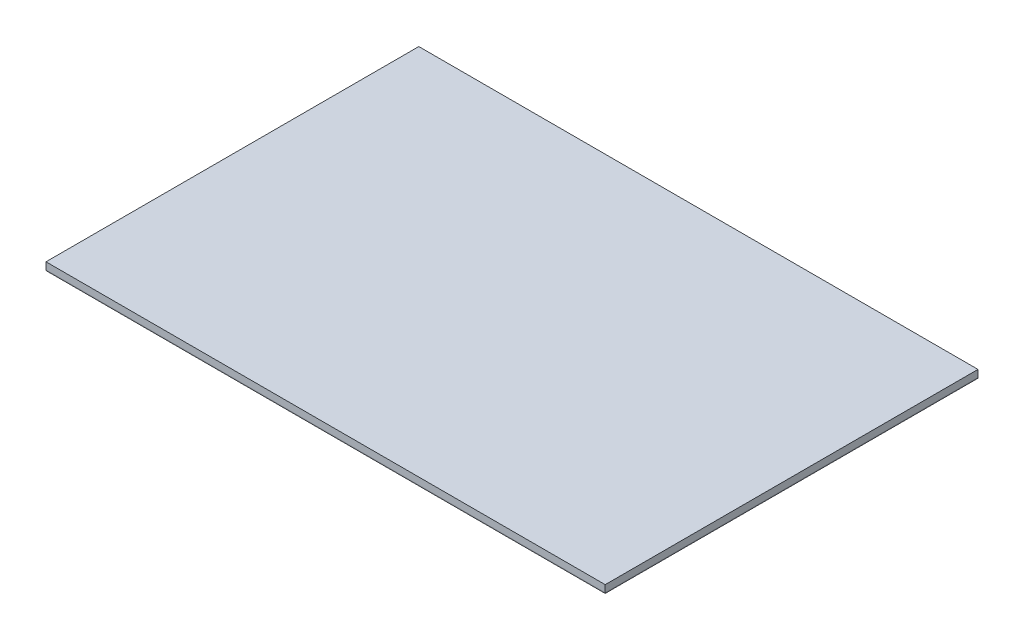
ISO-10303-21;
HEADER;
FILE_DESCRIPTION(('STEP AP214'),'2;1');
FILE_NAME('part.step','',(''),(''),'','','');
FILE_SCHEMA(('AUTOMOTIVE_DESIGN { 1 0 10303 214 1 1 1 1 }'));
ENDSEC;
DATA;
#1=APPLICATION_CONTEXT('core data for automotive mechanical design processes');
#2=APPLICATION_PROTOCOL_DEFINITION('international standard','automotive_design',2000,#1);
#3=PRODUCT_CONTEXT('',#1,'mechanical');
#4=PRODUCT('Part','Part','',(#3));
#5=PRODUCT_RELATED_PRODUCT_CATEGORY('part','',(#4));
#6=PRODUCT_DEFINITION_FORMATION('','',#4);
#7=PRODUCT_DEFINITION_CONTEXT('part definition',#1,'design');
#8=PRODUCT_DEFINITION('design','',#6,#7);
#9=PRODUCT_DEFINITION_SHAPE('','',#8);
#10=(LENGTH_UNIT() NAMED_UNIT(*) SI_UNIT(.MILLI.,.METRE.));
#11=(NAMED_UNIT(*) PLANE_ANGLE_UNIT() SI_UNIT($,.RADIAN.));
#12=(NAMED_UNIT(*) SI_UNIT($,.STERADIAN.) SOLID_ANGLE_UNIT());
#13=UNCERTAINTY_MEASURE_WITH_UNIT(LENGTH_MEASURE(1.E-05),#10,'distance_accuracy_value','');
#14=(GEOMETRIC_REPRESENTATION_CONTEXT(3) GLOBAL_UNCERTAINTY_ASSIGNED_CONTEXT((#13)) GLOBAL_UNIT_ASSIGNED_CONTEXT((#10,
#11,#12)) REPRESENTATION_CONTEXT('',''));
#15=CARTESIAN_POINT('',(0.,0.,0.));
#16=DIRECTION('',(0.,0.,1.));
#17=DIRECTION('',(1.,0.,0.));
#18=AXIS2_PLACEMENT_3D('',#15,#16,#17);
#19=CARTESIAN_POINT('',(-750.,0.,500.));
#20=DIRECTION('',(0.,-1.,0.));
#21=DIRECTION('',(0.,0.,-1.));
#22=AXIS2_PLACEMENT_3D('',#19,#20,#21);
#23=PLANE('',#22);
#24=DIRECTION('',(-1.,0.,0.));
#25=VECTOR('',#24,1.);
#26=CARTESIAN_POINT('',(0.,0.,0.));
#27=LINE('',#26,#25);
#28=CARTESIAN_POINT('',(0.,0.,0.));
#29=VERTEX_POINT('',#28);
#30=CARTESIAN_POINT('',(-1500.,0.,0.));
#31=VERTEX_POINT('',#30);
#32=EDGE_CURVE('P0_E28',#29,#31,#27,.T.);
#33=ORIENTED_EDGE('',*,*,#32,.F.);
#34=DIRECTION('',(0.,0.,-1.));
#35=VECTOR('',#34,1.);
#36=CARTESIAN_POINT('',(0.,0.,1000.));
#37=LINE('',#36,#35);
#38=CARTESIAN_POINT('',(0.,0.,1000.));
#39=VERTEX_POINT('',#38);
#40=EDGE_CURVE('P0_E69',#39,#29,#37,.T.);
#41=ORIENTED_EDGE('',*,*,#40,.F.);
#42=DIRECTION('',(1.,0.,0.));
#43=VECTOR('',#42,1.);
#44=CARTESIAN_POINT('',(-1500.,0.,1000.));
#45=LINE('',#44,#43);
#46=CARTESIAN_POINT('',(-1500.,0.,1000.));
#47=VERTEX_POINT('',#46);
#48=EDGE_CURVE('P0_E21',#47,#39,#45,.T.);
#49=ORIENTED_EDGE('',*,*,#48,.F.);
#50=DIRECTION('',(0.,0.,1.));
#51=VECTOR('',#50,1.);
#52=CARTESIAN_POINT('',(-1500.,0.,0.));
#53=LINE('',#52,#51);
#54=EDGE_CURVE('P0_E70',#31,#47,#53,.T.);
#55=ORIENTED_EDGE('',*,*,#54,.F.);
#56=EDGE_LOOP('',(#33,#41,#49,#55));
#57=FACE_BOUND('',#56,.T.);
#58=ADVANCED_FACE('P0_F17',(#57),#23,.T.);
#59=CARTESIAN_POINT('',(-750.,19.,500.));
#60=DIRECTION('',(0.,1.,0.));
#61=DIRECTION('',(1.,0.,0.));
#62=AXIS2_PLACEMENT_3D('',#59,#60,#61);
#63=PLANE('',#62);
#64=DIRECTION('',(-1.,0.,0.));
#65=VECTOR('',#64,1.);
#66=CARTESIAN_POINT('',(0.,19.,0.));
#67=LINE('',#66,#65);
#68=CARTESIAN_POINT('',(0.,19.,0.));
#69=VERTEX_POINT('',#68);
#70=CARTESIAN_POINT('',(-1500.,19.,0.));
#71=VERTEX_POINT('',#70);
#72=EDGE_CURVE('P0_E11',#69,#71,#67,.T.);
#73=ORIENTED_EDGE('',*,*,#72,.T.);
#74=DIRECTION('',(0.,0.,1.));
#75=VECTOR('',#74,1.);
#76=CARTESIAN_POINT('',(-1500.,19.,0.));
#77=LINE('',#76,#75);
#78=CARTESIAN_POINT('',(-1500.,19.,1000.));
#79=VERTEX_POINT('',#78);
#80=EDGE_CURVE('P0_E95',#71,#79,#77,.T.);
#81=ORIENTED_EDGE('',*,*,#80,.T.);
#82=DIRECTION('',(1.,0.,0.));
#83=VECTOR('',#82,1.);
#84=CARTESIAN_POINT('',(-1500.,19.,1000.));
#85=LINE('',#84,#83);
#86=CARTESIAN_POINT('',(0.,19.,1000.));
#87=VERTEX_POINT('',#86);
#88=EDGE_CURVE('P0_E98',#79,#87,#85,.T.);
#89=ORIENTED_EDGE('',*,*,#88,.T.);
#90=DIRECTION('',(0.,0.,-1.));
#91=VECTOR('',#90,1.);
#92=CARTESIAN_POINT('',(0.,19.,1000.));
#93=LINE('',#92,#91);
#94=EDGE_CURVE('P0_E82',#87,#69,#93,.T.);
#95=ORIENTED_EDGE('',*,*,#94,.T.);
#96=EDGE_LOOP('',(#73,#81,#89,#95));
#97=FACE_BOUND('',#96,.T.);
#98=ADVANCED_FACE('P0_F119',(#97),#63,.T.);
#99=CARTESIAN_POINT('',(0.,0.,0.));
#100=DIRECTION('',(0.,0.,-1.));
#101=DIRECTION('',(0.,-1.,0.));
#102=AXIS2_PLACEMENT_3D('',#99,#100,#101);
#103=PLANE('',#102);
#104=ORIENTED_EDGE('',*,*,#32,.T.);
#105=DIRECTION('',(0.,1.,0.));
#106=VECTOR('',#105,1.);
#107=CARTESIAN_POINT('',(-1500.,0.,0.));
#108=LINE('',#107,#106);
#109=EDGE_CURVE('P0_E74',#31,#71,#108,.T.);
#110=ORIENTED_EDGE('',*,*,#109,.T.);
#111=ORIENTED_EDGE('',*,*,#72,.F.);
#112=DIRECTION('',(0.,1.,0.));
#113=VECTOR('',#112,1.);
#114=CARTESIAN_POINT('',(0.,0.,0.));
#115=LINE('',#114,#113);
#116=EDGE_CURVE('P0_E77',#29,#69,#115,.T.);
#117=ORIENTED_EDGE('',*,*,#116,.F.);
#118=EDGE_LOOP('',(#104,#110,#111,#117));
#119=FACE_BOUND('',#118,.T.);
#120=ADVANCED_FACE('P0_F78',(#119),#103,.T.);
#121=CARTESIAN_POINT('',(-1500.,0.,0.));
#122=DIRECTION('',(-1.,0.,0.));
#123=DIRECTION('',(0.,1.,0.));
#124=AXIS2_PLACEMENT_3D('',#121,#122,#123);
#125=PLANE('',#124);
#126=ORIENTED_EDGE('',*,*,#54,.T.);
#127=DIRECTION('',(0.,1.,0.));
#128=VECTOR('',#127,1.);
#129=CARTESIAN_POINT('',(-1500.,0.,1000.));
#130=LINE('',#129,#128);
#131=EDGE_CURVE('P0_E102',#47,#79,#130,.T.);
#132=ORIENTED_EDGE('',*,*,#131,.T.);
#133=ORIENTED_EDGE('',*,*,#80,.F.);
#134=ORIENTED_EDGE('',*,*,#109,.F.);
#135=EDGE_LOOP('',(#126,#132,#133,#134));
#136=FACE_BOUND('',#135,.T.);
#137=ADVANCED_FACE('P0_F173',(#136),#125,.T.);
#138=CARTESIAN_POINT('',(-1500.,0.,1000.));
#139=DIRECTION('',(0.,0.,1.));
#140=DIRECTION('',(1.,0.,0.));
#141=AXIS2_PLACEMENT_3D('',#138,#139,#140);
#142=PLANE('',#141);
#143=ORIENTED_EDGE('',*,*,#48,.T.);
#144=DIRECTION('',(0.,1.,0.));
#145=VECTOR('',#144,1.);
#146=CARTESIAN_POINT('',(0.,0.,1000.));
#147=LINE('',#146,#145);
#148=EDGE_CURVE('P0_E86',#39,#87,#147,.T.);
#149=ORIENTED_EDGE('',*,*,#148,.T.);
#150=ORIENTED_EDGE('',*,*,#88,.F.);
#151=ORIENTED_EDGE('',*,*,#131,.F.);
#152=EDGE_LOOP('',(#143,#149,#150,#151));
#153=FACE_BOUND('',#152,.T.);
#154=ADVANCED_FACE('P0_F181',(#153),#142,.T.);
#155=CARTESIAN_POINT('',(0.,0.,1000.));
#156=DIRECTION('',(1.,0.,0.));
#157=DIRECTION('',(0.,1.,0.));
#158=AXIS2_PLACEMENT_3D('',#155,#156,#157);
#159=PLANE('',#158);
#160=ORIENTED_EDGE('',*,*,#40,.T.);
#161=ORIENTED_EDGE('',*,*,#116,.T.);
#162=ORIENTED_EDGE('',*,*,#94,.F.);
#163=ORIENTED_EDGE('',*,*,#148,.F.);
#164=EDGE_LOOP('',(#160,#161,#162,#163));
#165=FACE_BOUND('',#164,.T.);
#166=ADVANCED_FACE('P0_F19',(#165),#159,.T.);
#167=CLOSED_SHELL('',(#58,#98,#120,#137,#154,#166));
#168=MANIFOLD_SOLID_BREP('P0_B1',#167);
#169=CARTESIAN_POINT('',(-750.,0.,500.));
#170=DIRECTION('',(0.,-1.,0.));
#171=DIRECTION('',(0.,0.,-1.));
#172=AXIS2_PLACEMENT_3D('',#169,#170,#171);
#173=PLANE('',#172);
#174=DIRECTION('',(1.,0.,0.));
#175=VECTOR('',#174,1.);
#176=CARTESIAN_POINT('',(-1500.,0.,0.));
#177=LINE('',#176,#175);
#178=CARTESIAN_POINT('',(-1500.,0.,0.));
#179=VERTEX_POINT('',#178);
#180=CARTESIAN_POINT('',(0.,0.,0.));
#181=VERTEX_POINT('',#180);
#182=EDGE_CURVE('P1_E28',#179,#181,#177,.T.);
#183=ORIENTED_EDGE('',*,*,#182,.F.);
#184=DIRECTION('',(0.,0.,-1.));
#185=VECTOR('',#184,1.);
#186=CARTESIAN_POINT('',(-1500.,0.,1000.));
#187=LINE('',#186,#185);
#188=CARTESIAN_POINT('',(-1500.,0.,1000.));
#189=VERTEX_POINT('',#188);
#190=EDGE_CURVE('P1_E75',#189,#179,#187,.T.);
#191=ORIENTED_EDGE('',*,*,#190,.F.);
#192=DIRECTION('',(-1.,0.,0.));
#193=VECTOR('',#192,1.);
#194=CARTESIAN_POINT('',(0.,0.,1000.));
#195=LINE('',#194,#193);
#196=CARTESIAN_POINT('',(0.,0.,1000.));
#197=VERTEX_POINT('',#196);
#198=EDGE_CURVE('P1_E65',#197,#189,#195,.T.);
#199=ORIENTED_EDGE('',*,*,#198,.F.);
#200=DIRECTION('',(0.,0.,1.));
#201=VECTOR('',#200,1.);
#202=CARTESIAN_POINT('',(0.,0.,0.));
#203=LINE('',#202,#201);
#204=EDGE_CURVE('P1_E77',#181,#197,#203,.T.);
#205=ORIENTED_EDGE('',*,*,#204,.F.);
#206=EDGE_LOOP('',(#183,#191,#199,#205));
#207=FACE_BOUND('',#206,.T.);
#208=ADVANCED_FACE('P1_F17',(#207),#173,.F.);
#209=CARTESIAN_POINT('',(-750.,-1.5,500.));
#210=DIRECTION('',(0.,-1.,0.));
#211=DIRECTION('',(0.,0.,-1.));
#212=AXIS2_PLACEMENT_3D('',#209,#210,#211);
#213=PLANE('',#212);
#214=DIRECTION('',(1.,0.,0.));
#215=VECTOR('',#214,1.);
#216=CARTESIAN_POINT('',(-1500.,-1.5,0.));
#217=LINE('',#216,#215);
#218=CARTESIAN_POINT('',(-1500.,-1.5,0.));
#219=VERTEX_POINT('',#218);
#220=CARTESIAN_POINT('',(0.,-1.5,0.));
#221=VERTEX_POINT('',#220);
#222=EDGE_CURVE('P1_E11',#219,#221,#217,.T.);
#223=ORIENTED_EDGE('',*,*,#222,.T.);
#224=DIRECTION('',(0.,0.,1.));
#225=VECTOR('',#224,1.);
#226=CARTESIAN_POINT('',(0.,-1.5,0.));
#227=LINE('',#226,#225);
#228=CARTESIAN_POINT('',(0.,-1.5,1000.));
#229=VERTEX_POINT('',#228);
#230=EDGE_CURVE('P1_E118',#221,#229,#227,.T.);
#231=ORIENTED_EDGE('',*,*,#230,.T.);
#232=DIRECTION('',(-1.,0.,0.));
#233=VECTOR('',#232,1.);
#234=CARTESIAN_POINT('',(0.,-1.5,1000.));
#235=LINE('',#234,#233);
#236=CARTESIAN_POINT('',(-1500.,-1.5,1000.));
#237=VERTEX_POINT('',#236);
#238=EDGE_CURVE('P1_E100',#229,#237,#235,.T.);
#239=ORIENTED_EDGE('',*,*,#238,.T.);
#240=DIRECTION('',(0.,0.,-1.));
#241=VECTOR('',#240,1.);
#242=CARTESIAN_POINT('',(-1500.,-1.5,1000.));
#243=LINE('',#242,#241);
#244=EDGE_CURVE('P1_E89',#237,#219,#243,.T.);
#245=ORIENTED_EDGE('',*,*,#244,.T.);
#246=EDGE_LOOP('',(#223,#231,#239,#245));
#247=FACE_BOUND('',#246,.T.);
#248=ADVANCED_FACE('P1_F19',(#247),#213,.T.);
#249=CARTESIAN_POINT('',(-1500.,0.,0.));
#250=DIRECTION('',(0.,0.,-1.));
#251=DIRECTION('',(0.,-1.,0.));
#252=AXIS2_PLACEMENT_3D('',#249,#250,#251);
#253=PLANE('',#252);
#254=ORIENTED_EDGE('',*,*,#182,.T.);
#255=DIRECTION('',(0.,-1.,0.));
#256=VECTOR('',#255,1.);
#257=CARTESIAN_POINT('',(0.,0.,0.));
#258=LINE('',#257,#256);
#259=EDGE_CURVE('P1_E81',#181,#221,#258,.T.);
#260=ORIENTED_EDGE('',*,*,#259,.T.);
#261=ORIENTED_EDGE('',*,*,#222,.F.);
#262=DIRECTION('',(0.,-1.,0.));
#263=VECTOR('',#262,1.);
#264=CARTESIAN_POINT('',(-1500.,0.,0.));
#265=LINE('',#264,#263);
#266=EDGE_CURVE('P1_E84',#179,#219,#265,.T.);
#267=ORIENTED_EDGE('',*,*,#266,.F.);
#268=EDGE_LOOP('',(#254,#260,#261,#267));
#269=FACE_BOUND('',#268,.T.);
#270=ADVANCED_FACE('P1_F85',(#269),#253,.T.);
#271=CARTESIAN_POINT('',(0.,0.,0.));
#272=DIRECTION('',(1.,0.,0.));
#273=DIRECTION('',(0.,1.,0.));
#274=AXIS2_PLACEMENT_3D('',#271,#272,#273);
#275=PLANE('',#274);
#276=ORIENTED_EDGE('',*,*,#204,.T.);
#277=DIRECTION('',(0.,-1.,0.));
#278=VECTOR('',#277,1.);
#279=CARTESIAN_POINT('',(0.,0.,1000.));
#280=LINE('',#279,#278);
#281=EDGE_CURVE('P1_E105',#197,#229,#280,.T.);
#282=ORIENTED_EDGE('',*,*,#281,.T.);
#283=ORIENTED_EDGE('',*,*,#230,.F.);
#284=ORIENTED_EDGE('',*,*,#259,.F.);
#285=EDGE_LOOP('',(#276,#282,#283,#284));
#286=FACE_BOUND('',#285,.T.);
#287=ADVANCED_FACE('P1_F128',(#286),#275,.T.);
#288=CARTESIAN_POINT('',(0.,0.,1000.));
#289=DIRECTION('',(0.,0.,1.));
#290=DIRECTION('',(1.,0.,0.));
#291=AXIS2_PLACEMENT_3D('',#288,#289,#290);
#292=PLANE('',#291);
#293=ORIENTED_EDGE('',*,*,#198,.T.);
#294=DIRECTION('',(0.,-1.,0.));
#295=VECTOR('',#294,1.);
#296=CARTESIAN_POINT('',(-1500.,0.,1000.));
#297=LINE('',#296,#295);
#298=EDGE_CURVE('P1_E21',#189,#237,#297,.T.);
#299=ORIENTED_EDGE('',*,*,#298,.T.);
#300=ORIENTED_EDGE('',*,*,#238,.F.);
#301=ORIENTED_EDGE('',*,*,#281,.F.);
#302=EDGE_LOOP('',(#293,#299,#300,#301));
#303=FACE_BOUND('',#302,.T.);
#304=ADVANCED_FACE('P1_F129',(#303),#292,.T.);
#305=CARTESIAN_POINT('',(-1500.,0.,1000.));
#306=DIRECTION('',(-1.,0.,0.));
#307=DIRECTION('',(0.,1.,0.));
#308=AXIS2_PLACEMENT_3D('',#305,#306,#307);
#309=PLANE('',#308);
#310=ORIENTED_EDGE('',*,*,#190,.T.);
#311=ORIENTED_EDGE('',*,*,#266,.T.);
#312=ORIENTED_EDGE('',*,*,#244,.F.);
#313=ORIENTED_EDGE('',*,*,#298,.F.);
#314=EDGE_LOOP('',(#310,#311,#312,#313));
#315=FACE_BOUND('',#314,.T.);
#316=ADVANCED_FACE('P1_F91',(#315),#309,.T.);
#317=CLOSED_SHELL('',(#208,#248,#270,#287,#304,#316));
#318=MANIFOLD_SOLID_BREP('P1_B1',#317);
#319=ADVANCED_BREP_SHAPE_REPRESENTATION('',(#18,#168,#318),#14);
#320=SHAPE_DEFINITION_REPRESENTATION(#9,#319);
ENDSEC;
END-ISO-10303-21;
